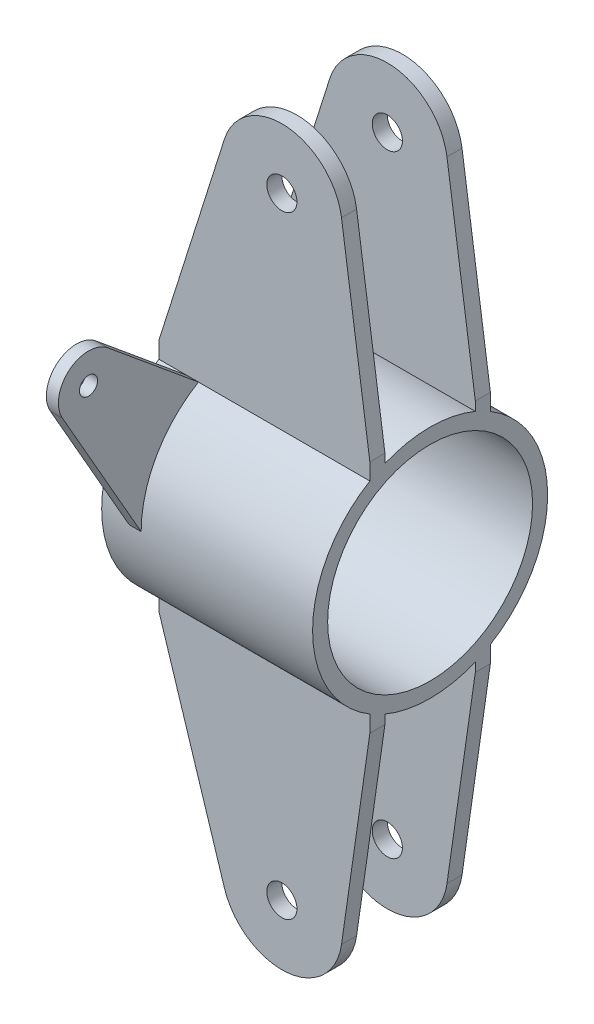
ISO-10303-21;
HEADER;
FILE_DESCRIPTION(('STEP AP214'),'2;1');
FILE_NAME('part.step','',(''),(''),'','','');
FILE_SCHEMA(('AUTOMOTIVE_DESIGN { 1 0 10303 214 1 1 1 1 }'));
ENDSEC;
DATA;
#1=APPLICATION_CONTEXT('core data for automotive mechanical design processes');
#2=APPLICATION_PROTOCOL_DEFINITION('international standard','automotive_design',2000,#1);
#3=PRODUCT_CONTEXT('',#1,'mechanical');
#4=PRODUCT('Part','Part','',(#3));
#5=PRODUCT_RELATED_PRODUCT_CATEGORY('part','',(#4));
#6=PRODUCT_DEFINITION_FORMATION('','',#4);
#7=PRODUCT_DEFINITION_CONTEXT('part definition',#1,'design');
#8=PRODUCT_DEFINITION('design','',#6,#7);
#9=PRODUCT_DEFINITION_SHAPE('','',#8);
#10=(LENGTH_UNIT() NAMED_UNIT(*) SI_UNIT(.MILLI.,.METRE.));
#11=(NAMED_UNIT(*) PLANE_ANGLE_UNIT() SI_UNIT($,.RADIAN.));
#12=(NAMED_UNIT(*) SI_UNIT($,.STERADIAN.) SOLID_ANGLE_UNIT());
#13=UNCERTAINTY_MEASURE_WITH_UNIT(LENGTH_MEASURE(1.E-05),#10,'distance_accuracy_value','');
#14=(GEOMETRIC_REPRESENTATION_CONTEXT(3) GLOBAL_UNCERTAINTY_ASSIGNED_CONTEXT((#13)) GLOBAL_UNIT_ASSIGNED_CONTEXT((#10,
#11,#12)) REPRESENTATION_CONTEXT('',''));
#15=CARTESIAN_POINT('',(0.,0.,0.));
#16=DIRECTION('',(0.,0.,1.));
#17=DIRECTION('',(1.,0.,0.));
#18=AXIS2_PLACEMENT_3D('',#15,#16,#17);
#19=CARTESIAN_POINT('',(35.,0.,0.));
#20=DIRECTION('',(-1.,0.,0.));
#21=DIRECTION('',(0.,0.,1.));
#22=AXIS2_PLACEMENT_3D('',#19,#20,#21);
#23=CYLINDRICAL_SURFACE('',#22,39.007);
#24=CARTESIAN_POINT('',(-21.9,0.,0.));
#25=DIRECTION('',(1.,0.,0.));
#26=DIRECTION('',(0.,0.,1.));
#27=AXIS2_PLACEMENT_3D('',#24,#25,#26);
#28=CIRCLE('',#27,39.007);
#29=CARTESIAN_POINT('',(-21.9,33.4894916205069,20.));
#30=VERTEX_POINT('',#29);
#31=CARTESIAN_POINT('',(-21.9,0.,39.007));
#32=VERTEX_POINT('',#31);
#33=EDGE_CURVE('E243',#30,#32,#28,.T.);
#34=ORIENTED_EDGE('',*,*,#33,.T.);
#35=DIRECTION('',(-1.,0.,0.));
#36=VECTOR('',#35,1.);
#37=CARTESIAN_POINT('',(-21.9,0.,39.007));
#38=LINE('',#37,#36);
#39=CARTESIAN_POINT('',(-25.9,0.,39.007));
#40=VERTEX_POINT('',#39);
#41=EDGE_CURVE('E227',#32,#40,#38,.T.);
#42=ORIENTED_EDGE('',*,*,#41,.T.);
#43=CARTESIAN_POINT('',(-25.9,0.,0.));
#44=DIRECTION('',(1.,0.,0.));
#45=DIRECTION('',(0.,0.,1.));
#46=AXIS2_PLACEMENT_3D('',#43,#44,#45);
#47=CIRCLE('',#46,39.007);
#48=CARTESIAN_POINT('',(-25.9,33.4894916205069,20.));
#49=VERTEX_POINT('',#48);
#50=EDGE_CURVE('E267',#49,#40,#47,.T.);
#51=ORIENTED_EDGE('',*,*,#50,.F.);
#52=DIRECTION('',(1.,0.,0.));
#53=VECTOR('',#52,1.);
#54=CARTESIAN_POINT('',(-42.4459988394961,33.4894916205069,20.));
#55=LINE('',#54,#53);
#56=CARTESIAN_POINT('',(-35.,33.4894916205069,20.));
#57=VERTEX_POINT('',#56);
#58=EDGE_CURVE('E412',#57,#49,#55,.T.);
#59=ORIENTED_EDGE('',*,*,#58,.F.);
#60=CARTESIAN_POINT('',(-35.,0.,0.));
#61=DIRECTION('',(1.,0.,0.));
#62=DIRECTION('',(0.,0.,-1.));
#63=AXIS2_PLACEMENT_3D('',#60,#61,#62);
#64=CIRCLE('',#63,39.007);
#65=CARTESIAN_POINT('',(-35.,-33.4894916205069,20.));
#66=VERTEX_POINT('',#65);
#67=EDGE_CURVE('E625',#57,#66,#64,.T.);
#68=ORIENTED_EDGE('',*,*,#67,.T.);
#69=DIRECTION('',(1.,0.,0.));
#70=VECTOR('',#69,1.);
#71=CARTESIAN_POINT('',(-42.4459988394961,-33.4894916205069,20.));
#72=LINE('',#71,#70);
#73=CARTESIAN_POINT('',(35.,-33.4894916205069,20.));
#74=VERTEX_POINT('',#73);
#75=EDGE_CURVE('E457',#66,#74,#72,.T.);
#76=ORIENTED_EDGE('',*,*,#75,.T.);
#77=CARTESIAN_POINT('',(35.,0.,0.));
#78=DIRECTION('',(1.,0.,0.));
#79=DIRECTION('',(0.,0.,-1.));
#80=AXIS2_PLACEMENT_3D('',#77,#78,#79);
#81=CIRCLE('',#80,39.007);
#82=CARTESIAN_POINT('',(35.,33.4894916205069,20.));
#83=VERTEX_POINT('',#82);
#84=EDGE_CURVE('E640',#83,#74,#81,.T.);
#85=ORIENTED_EDGE('',*,*,#84,.F.);
#86=EDGE_CURVE('E250',#30,#83,#55,.T.);
#87=ORIENTED_EDGE('',*,*,#86,.F.);
#88=EDGE_LOOP('',(#34,#42,#51,#59,#68,#76,#85,#87));
#89=FACE_BOUND('',#88,.T.);
#90=ADVANCED_FACE('F39',(#89),#23,.T.);
#91=CARTESIAN_POINT('',(-35.,-33.4894916205069,-20.));
#92=VERTEX_POINT('',#91);
#93=CARTESIAN_POINT('',(-35.,33.4894916205069,-20.));
#94=VERTEX_POINT('',#93);
#95=EDGE_CURVE('E43',#92,#94,#64,.T.);
#96=ORIENTED_EDGE('',*,*,#95,.T.);
#97=DIRECTION('',(1.,0.,0.));
#98=VECTOR('',#97,1.);
#99=CARTESIAN_POINT('',(-42.4459988394961,33.4894916205069,-20.));
#100=LINE('',#99,#98);
#101=CARTESIAN_POINT('',(35.,33.4894916205069,-20.));
#102=VERTEX_POINT('',#101);
#103=EDGE_CURVE('E327',#94,#102,#100,.T.);
#104=ORIENTED_EDGE('',*,*,#103,.T.);
#105=CARTESIAN_POINT('',(35.,-33.4894916205069,-20.));
#106=VERTEX_POINT('',#105);
#107=EDGE_CURVE('E11',#106,#102,#81,.T.);
#108=ORIENTED_EDGE('',*,*,#107,.F.);
#109=DIRECTION('',(1.,0.,0.));
#110=VECTOR('',#109,1.);
#111=CARTESIAN_POINT('',(-42.4459988394961,-33.4894916205069,-20.));
#112=LINE('',#111,#110);
#113=EDGE_CURVE('E545',#92,#106,#112,.T.);
#114=ORIENTED_EDGE('',*,*,#113,.F.);
#115=EDGE_LOOP('',(#96,#104,#108,#114));
#116=FACE_BOUND('',#115,.T.);
#117=ADVANCED_FACE('F579',(#116),#23,.T.);
#118=CARTESIAN_POINT('',(35.,36.0075832152062,-15.));
#119=VERTEX_POINT('',#118);
#120=CARTESIAN_POINT('',(35.,36.0075832152062,15.));
#121=VERTEX_POINT('',#120);
#122=EDGE_CURVE('E49',#119,#121,#81,.T.);
#123=ORIENTED_EDGE('',*,*,#122,.F.);
#124=DIRECTION('',(1.,0.,0.));
#125=VECTOR('',#124,1.);
#126=CARTESIAN_POINT('',(-42.4459988394961,36.0075832152062,-15.));
#127=LINE('',#126,#125);
#128=CARTESIAN_POINT('',(-35.,36.0075832152062,-15.));
#129=VERTEX_POINT('',#128);
#130=EDGE_CURVE('E341',#129,#119,#127,.T.);
#131=ORIENTED_EDGE('',*,*,#130,.F.);
#132=CARTESIAN_POINT('',(-35.,36.0075832152062,15.));
#133=VERTEX_POINT('',#132);
#134=EDGE_CURVE('E595',#129,#133,#64,.T.);
#135=ORIENTED_EDGE('',*,*,#134,.T.);
#136=DIRECTION('',(1.,0.,0.));
#137=VECTOR('',#136,1.);
#138=CARTESIAN_POINT('',(-42.4459988394961,36.0075832152062,15.));
#139=LINE('',#138,#137);
#140=EDGE_CURVE('E390',#133,#121,#139,.T.);
#141=ORIENTED_EDGE('',*,*,#140,.T.);
#142=EDGE_LOOP('',(#123,#131,#135,#141));
#143=FACE_BOUND('',#142,.T.);
#144=ADVANCED_FACE('F576',(#143),#23,.T.);
#145=CARTESIAN_POINT('',(35.,0.,0.));
#146=DIRECTION('',(1.,0.,0.));
#147=DIRECTION('',(0.,0.,-1.));
#148=AXIS2_PLACEMENT_3D('',#145,#146,#147);
#149=PLANE('',#148);
#150=ORIENTED_EDGE('',*,*,#107,.T.);
#151=DIRECTION('',(0.,1.,0.));
#152=VECTOR('',#151,1.);
#153=CARTESIAN_POINT('',(35.,39.007,-20.));
#154=LINE('',#153,#152);
#155=CARTESIAN_POINT('',(35.,39.007,-20.));
#156=VERTEX_POINT('',#155);
#157=EDGE_CURVE('E320',#102,#156,#154,.T.);
#158=ORIENTED_EDGE('',*,*,#157,.T.);
#159=DIRECTION('',(0.,0.,1.));
#160=VECTOR('',#159,1.);
#161=CARTESIAN_POINT('',(35.,39.007,-20.));
#162=LINE('',#161,#160);
#163=CARTESIAN_POINT('',(35.,39.007,-15.));
#164=VERTEX_POINT('',#163);
#165=EDGE_CURVE('E334',#156,#164,#162,.T.);
#166=ORIENTED_EDGE('',*,*,#165,.T.);
#167=DIRECTION('',(0.,-1.,0.));
#168=VECTOR('',#167,1.);
#169=CARTESIAN_POINT('',(35.,39.007,-15.));
#170=LINE('',#169,#168);
#171=EDGE_CURVE('E337',#164,#119,#170,.T.);
#172=ORIENTED_EDGE('',*,*,#171,.T.);
#173=ORIENTED_EDGE('',*,*,#122,.T.);
#174=DIRECTION('',(0.,1.,0.));
#175=VECTOR('',#174,1.);
#176=CARTESIAN_POINT('',(35.,39.007,15.));
#177=LINE('',#176,#175);
#178=CARTESIAN_POINT('',(35.,39.007,15.));
#179=VERTEX_POINT('',#178);
#180=EDGE_CURVE('E402',#121,#179,#177,.T.);
#181=ORIENTED_EDGE('',*,*,#180,.T.);
#182=DIRECTION('',(0.,0.,1.));
#183=VECTOR('',#182,1.);
#184=CARTESIAN_POINT('',(35.,39.007,20.));
#185=LINE('',#184,#183);
#186=CARTESIAN_POINT('',(35.,39.007,20.));
#187=VERTEX_POINT('',#186);
#188=EDGE_CURVE('E406',#179,#187,#185,.T.);
#189=ORIENTED_EDGE('',*,*,#188,.T.);
#190=DIRECTION('',(0.,-1.,0.));
#191=VECTOR('',#190,1.);
#192=CARTESIAN_POINT('',(35.,39.007,20.));
#193=LINE('',#192,#191);
#194=EDGE_CURVE('E384',#187,#83,#193,.T.);
#195=ORIENTED_EDGE('',*,*,#194,.T.);
#196=ORIENTED_EDGE('',*,*,#84,.T.);
#197=DIRECTION('',(0.,-1.,0.));
#198=VECTOR('',#197,1.);
#199=CARTESIAN_POINT('',(35.,-39.007,20.));
#200=LINE('',#199,#198);
#201=CARTESIAN_POINT('',(35.,-39.007,20.));
#202=VERTEX_POINT('',#201);
#203=EDGE_CURVE('E451',#74,#202,#200,.T.);
#204=ORIENTED_EDGE('',*,*,#203,.T.);
#205=DIRECTION('',(0.,0.,-1.));
#206=VECTOR('',#205,1.);
#207=CARTESIAN_POINT('',(35.,-39.007,20.));
#208=LINE('',#207,#206);
#209=CARTESIAN_POINT('',(35.,-39.007,15.));
#210=VERTEX_POINT('',#209);
#211=EDGE_CURVE('E465',#202,#210,#208,.T.);
#212=ORIENTED_EDGE('',*,*,#211,.T.);
#213=DIRECTION('',(0.,1.,0.));
#214=VECTOR('',#213,1.);
#215=CARTESIAN_POINT('',(35.,-39.007,15.));
#216=LINE('',#215,#214);
#217=CARTESIAN_POINT('',(35.,-36.0075832152062,15.));
#218=VERTEX_POINT('',#217);
#219=EDGE_CURVE('E469',#210,#218,#216,.T.);
#220=ORIENTED_EDGE('',*,*,#219,.T.);
#221=CARTESIAN_POINT('',(35.,-36.0075832152062,-15.));
#222=VERTEX_POINT('',#221);
#223=EDGE_CURVE('E50',#218,#222,#81,.T.);
#224=ORIENTED_EDGE('',*,*,#223,.T.);
#225=DIRECTION('',(0.,-1.,0.));
#226=VECTOR('',#225,1.);
#227=CARTESIAN_POINT('',(35.,-39.007,-15.));
#228=LINE('',#227,#226);
#229=CARTESIAN_POINT('',(35.,-39.007,-15.));
#230=VERTEX_POINT('',#229);
#231=EDGE_CURVE('E537',#222,#230,#228,.T.);
#232=ORIENTED_EDGE('',*,*,#231,.T.);
#233=DIRECTION('',(0.,0.,-1.));
#234=VECTOR('',#233,1.);
#235=CARTESIAN_POINT('',(35.,-39.007,-20.));
#236=LINE('',#235,#234);
#237=CARTESIAN_POINT('',(35.,-39.007,-20.));
#238=VERTEX_POINT('',#237);
#239=EDGE_CURVE('E541',#230,#238,#236,.T.);
#240=ORIENTED_EDGE('',*,*,#239,.T.);
#241=DIRECTION('',(0.,1.,0.));
#242=VECTOR('',#241,1.);
#243=CARTESIAN_POINT('',(35.,-39.007,-20.));
#244=LINE('',#243,#242);
#245=EDGE_CURVE('E517',#238,#106,#244,.T.);
#246=ORIENTED_EDGE('',*,*,#245,.T.);
#247=EDGE_LOOP('',(#150,#158,#166,#172,#173,#181,#189,#195,#196,#204,#212,#220,#224,#232,#240,#246));
#248=FACE_BOUND('',#247,.T.);
#249=CARTESIAN_POINT('',(35.,0.,0.));
#250=DIRECTION('',(1.,0.,0.));
#251=DIRECTION('',(0.,0.,-1.));
#252=AXIS2_PLACEMENT_3D('',#249,#250,#251);
#253=CIRCLE('',#252,34.007);
#254=CARTESIAN_POINT('',(35.,0.,-34.007));
#255=VERTEX_POINT('',#254);
#256=EDGE_CURVE('E552',#255,#255,#253,.T.);
#257=ORIENTED_EDGE('',*,*,#256,.F.);
#258=EDGE_LOOP('',(#257));
#259=FACE_BOUND('',#258,.T.);
#260=ADVANCED_FACE('F589',(#248,#259),#149,.T.);
#261=CARTESIAN_POINT('',(-35.,0.,0.));
#262=DIRECTION('',(1.,0.,0.));
#263=DIRECTION('',(0.,0.,-1.));
#264=AXIS2_PLACEMENT_3D('',#261,#262,#263);
#265=PLANE('',#264);
#266=ORIENTED_EDGE('',*,*,#95,.F.);
#267=DIRECTION('',(0.,-1.,0.));
#268=VECTOR('',#267,1.);
#269=CARTESIAN_POINT('',(-35.,-39.007,-20.));
#270=LINE('',#269,#268);
#271=CARTESIAN_POINT('',(-35.,-39.007,-20.));
#272=VERTEX_POINT('',#271);
#273=EDGE_CURVE('E529',#92,#272,#270,.T.);
#274=ORIENTED_EDGE('',*,*,#273,.T.);
#275=DIRECTION('',(0.,0.,1.));
#276=VECTOR('',#275,1.);
#277=CARTESIAN_POINT('',(-35.,-39.007,-20.));
#278=LINE('',#277,#276);
#279=CARTESIAN_POINT('',(-35.,-39.007,-15.));
#280=VERTEX_POINT('',#279);
#281=EDGE_CURVE('E524',#272,#280,#278,.T.);
#282=ORIENTED_EDGE('',*,*,#281,.T.);
#283=DIRECTION('',(0.,1.,0.));
#284=VECTOR('',#283,1.);
#285=CARTESIAN_POINT('',(-35.,-39.007,-15.));
#286=LINE('',#285,#284);
#287=CARTESIAN_POINT('',(-35.,-36.0075832152062,-15.));
#288=VERTEX_POINT('',#287);
#289=EDGE_CURVE('E520',#280,#288,#286,.T.);
#290=ORIENTED_EDGE('',*,*,#289,.T.);
#291=CARTESIAN_POINT('',(-35.,-36.0075832152062,15.));
#292=VERTEX_POINT('',#291);
#293=EDGE_CURVE('E556',#292,#288,#64,.T.);
#294=ORIENTED_EDGE('',*,*,#293,.F.);
#295=DIRECTION('',(0.,-1.,0.));
#296=VECTOR('',#295,1.);
#297=CARTESIAN_POINT('',(-35.,-39.007,15.));
#298=LINE('',#297,#296);
#299=CARTESIAN_POINT('',(-35.,-39.007,15.));
#300=VERTEX_POINT('',#299);
#301=EDGE_CURVE('E452',#292,#300,#298,.T.);
#302=ORIENTED_EDGE('',*,*,#301,.T.);
#303=DIRECTION('',(0.,0.,1.));
#304=VECTOR('',#303,1.);
#305=CARTESIAN_POINT('',(-35.,-39.007,20.));
#306=LINE('',#305,#304);
#307=CARTESIAN_POINT('',(-35.,-39.007,20.));
#308=VERTEX_POINT('',#307);
#309=EDGE_CURVE('E461',#300,#308,#306,.T.);
#310=ORIENTED_EDGE('',*,*,#309,.T.);
#311=DIRECTION('',(0.,1.,0.));
#312=VECTOR('',#311,1.);
#313=CARTESIAN_POINT('',(-35.,-39.007,20.));
#314=LINE('',#313,#312);
#315=EDGE_CURVE('E456',#308,#66,#314,.T.);
#316=ORIENTED_EDGE('',*,*,#315,.T.);
#317=ORIENTED_EDGE('',*,*,#67,.F.);
#318=DIRECTION('',(0.,1.,0.));
#319=VECTOR('',#318,1.);
#320=CARTESIAN_POINT('',(-35.,39.007,20.));
#321=LINE('',#320,#319);
#322=CARTESIAN_POINT('',(-35.,39.007,20.));
#323=VERTEX_POINT('',#322);
#324=EDGE_CURVE('E394',#57,#323,#321,.T.);
#325=ORIENTED_EDGE('',*,*,#324,.T.);
#326=DIRECTION('',(0.,0.,-1.));
#327=VECTOR('',#326,1.);
#328=CARTESIAN_POINT('',(-35.,39.007,20.));
#329=LINE('',#328,#327);
#330=CARTESIAN_POINT('',(-35.,39.007,15.));
#331=VERTEX_POINT('',#330);
#332=EDGE_CURVE('E389',#323,#331,#329,.T.);
#333=ORIENTED_EDGE('',*,*,#332,.T.);
#334=DIRECTION('',(0.,-1.,0.));
#335=VECTOR('',#334,1.);
#336=CARTESIAN_POINT('',(-35.,39.007,15.));
#337=LINE('',#336,#335);
#338=EDGE_CURVE('E385',#331,#133,#337,.T.);
#339=ORIENTED_EDGE('',*,*,#338,.T.);
#340=ORIENTED_EDGE('',*,*,#134,.F.);
#341=DIRECTION('',(0.,1.,0.));
#342=VECTOR('',#341,1.);
#343=CARTESIAN_POINT('',(-35.,39.007,-15.));
#344=LINE('',#343,#342);
#345=CARTESIAN_POINT('',(-35.,39.007,-15.));
#346=VERTEX_POINT('',#345);
#347=EDGE_CURVE('E323',#129,#346,#344,.T.);
#348=ORIENTED_EDGE('',*,*,#347,.T.);
#349=DIRECTION('',(0.,0.,-1.));
#350=VECTOR('',#349,1.);
#351=CARTESIAN_POINT('',(-35.,39.007,-20.));
#352=LINE('',#351,#350);
#353=CARTESIAN_POINT('',(-35.,39.007,-20.));
#354=VERTEX_POINT('',#353);
#355=EDGE_CURVE('E331',#346,#354,#352,.T.);
#356=ORIENTED_EDGE('',*,*,#355,.T.);
#357=DIRECTION('',(0.,-1.,0.));
#358=VECTOR('',#357,1.);
#359=CARTESIAN_POINT('',(-35.,39.007,-20.));
#360=LINE('',#359,#358);
#361=EDGE_CURVE('E326',#354,#94,#360,.T.);
#362=ORIENTED_EDGE('',*,*,#361,.T.);
#363=EDGE_LOOP('',(#266,#274,#282,#290,#294,#302,#310,#316,#317,#325,#333,#339,#340,#348,#356,#362));
#364=FACE_BOUND('',#363,.T.);
#365=CARTESIAN_POINT('',(-35.,0.,0.));
#366=DIRECTION('',(1.,0.,0.));
#367=DIRECTION('',(0.,0.,-1.));
#368=AXIS2_PLACEMENT_3D('',#365,#366,#367);
#369=CIRCLE('',#368,34.007);
#370=CARTESIAN_POINT('',(-35.,0.,-34.007));
#371=VERTEX_POINT('',#370);
#372=EDGE_CURVE('E533',#371,#371,#369,.T.);
#373=ORIENTED_EDGE('',*,*,#372,.T.);
#374=EDGE_LOOP('',(#373));
#375=FACE_BOUND('',#374,.T.);
#376=ADVANCED_FACE('F561',(#364,#375),#265,.F.);
#377=ORIENTED_EDGE('',*,*,#223,.F.);
#378=DIRECTION('',(1.,0.,0.));
#379=VECTOR('',#378,1.);
#380=CARTESIAN_POINT('',(-42.4459988394961,-36.0075832152062,15.));
#381=LINE('',#380,#379);
#382=EDGE_CURVE('E473',#292,#218,#381,.T.);
#383=ORIENTED_EDGE('',*,*,#382,.F.);
#384=ORIENTED_EDGE('',*,*,#293,.T.);
#385=DIRECTION('',(1.,0.,0.));
#386=VECTOR('',#385,1.);
#387=CARTESIAN_POINT('',(-42.4459988394961,-36.0075832152062,-15.));
#388=LINE('',#387,#386);
#389=EDGE_CURVE('E525',#288,#222,#388,.T.);
#390=ORIENTED_EDGE('',*,*,#389,.T.);
#391=EDGE_LOOP('',(#377,#383,#384,#390));
#392=FACE_BOUND('',#391,.T.);
#393=ADVANCED_FACE('F41',(#392),#23,.T.);
#394=CARTESIAN_POINT('',(35.,0.,0.));
#395=DIRECTION('',(-1.,0.,0.));
#396=DIRECTION('',(0.,0.,1.));
#397=AXIS2_PLACEMENT_3D('',#394,#395,#396);
#398=CYLINDRICAL_SURFACE('',#397,34.007);
#399=ORIENTED_EDGE('',*,*,#256,.T.);
#400=EDGE_LOOP('',(#399));
#401=FACE_BOUND('',#400,.T.);
#402=ORIENTED_EDGE('',*,*,#372,.F.);
#403=EDGE_LOOP('',(#402));
#404=FACE_BOUND('',#403,.T.);
#405=ADVANCED_FACE('F563',(#401,#404),#398,.F.);
#406=CARTESIAN_POINT('',(-42.4459988394961,-39.007,-20.));
#407=DIRECTION('',(0.,0.,-1.));
#408=DIRECTION('',(-1.,0.,0.));
#409=AXIS2_PLACEMENT_3D('',#406,#407,#408);
#410=PLANE('',#409);
#411=ORIENTED_EDGE('',*,*,#273,.F.);
#412=ORIENTED_EDGE('',*,*,#113,.T.);
#413=ORIENTED_EDGE('',*,*,#245,.F.);
#414=DIRECTION('',(0.142238081932219,0.989832474739157,0.));
#415=VECTOR('',#414,1.);
#416=CARTESIAN_POINT('',(25.5966494947831,-104.444761638644,-20.));
#417=LINE('',#416,#415);
#418=CARTESIAN_POINT('',(25.5966494947831,-104.444761638644,-20.));
#419=VERTEX_POINT('',#418);
#420=EDGE_CURVE('E501',#419,#238,#417,.T.);
#421=ORIENTED_EDGE('',*,*,#420,.F.);
#422=CARTESIAN_POINT('',(5.8,-101.6,-20.));
#423=DIRECTION('',(0.,0.,1.));
#424=DIRECTION('',(1.,0.,0.));
#425=AXIS2_PLACEMENT_3D('',#422,#423,#424);
#426=CIRCLE('',#425,20.);
#427=CARTESIAN_POINT('',(-13.2668398670798,-107.637848746295,-20.));
#428=VERTEX_POINT('',#427);
#429=EDGE_CURVE('E496',#428,#419,#426,.T.);
#430=ORIENTED_EDGE('',*,*,#429,.F.);
#431=DIRECTION('',(0.301892437314758,-0.953341993353988,0.));
#432=VECTOR('',#431,1.);
#433=CARTESIAN_POINT('',(-35.,-39.007,-20.));
#434=LINE('',#433,#432);
#435=EDGE_CURVE('E492',#272,#428,#434,.T.);
#436=ORIENTED_EDGE('',*,*,#435,.F.);
#437=EDGE_LOOP('',(#411,#412,#413,#421,#430,#436));
#438=FACE_BOUND('',#437,.T.);
#439=CARTESIAN_POINT('',(5.8,-101.6,-20.));
#440=DIRECTION('',(0.,0.,1.));
#441=DIRECTION('',(1.,0.,0.));
#442=AXIS2_PLACEMENT_3D('',#439,#440,#441);
#443=CIRCLE('',#442,5.007);
#444=CARTESIAN_POINT('',(10.807,-101.6,-20.));
#445=VERTEX_POINT('',#444);
#446=EDGE_CURVE('E484',#445,#445,#443,.T.);
#447=ORIENTED_EDGE('',*,*,#446,.T.);
#448=EDGE_LOOP('',(#447));
#449=FACE_BOUND('',#448,.T.);
#450=ADVANCED_FACE('F565',(#438,#449),#410,.T.);
#451=CARTESIAN_POINT('',(-42.4459988394961,-39.007,-15.));
#452=DIRECTION('',(0.,0.,1.));
#453=DIRECTION('',(1.,0.,0.));
#454=AXIS2_PLACEMENT_3D('',#451,#452,#453);
#455=PLANE('',#454);
#456=ORIENTED_EDGE('',*,*,#289,.F.);
#457=DIRECTION('',(0.301892437314758,-0.953341993353988,0.));
#458=VECTOR('',#457,1.);
#459=CARTESIAN_POINT('',(-35.,-39.007,-15.));
#460=LINE('',#459,#458);
#461=CARTESIAN_POINT('',(-13.2668398670798,-107.637848746295,-15.));
#462=VERTEX_POINT('',#461);
#463=EDGE_CURVE('E488',#280,#462,#460,.T.);
#464=ORIENTED_EDGE('',*,*,#463,.T.);
#465=CARTESIAN_POINT('',(5.8,-101.6,-15.));
#466=DIRECTION('',(0.,0.,1.));
#467=DIRECTION('',(1.,0.,0.));
#468=AXIS2_PLACEMENT_3D('',#465,#466,#467);
#469=CIRCLE('',#468,20.);
#470=CARTESIAN_POINT('',(25.5966494947831,-104.444761638644,-15.));
#471=VERTEX_POINT('',#470);
#472=EDGE_CURVE('E508',#462,#471,#469,.T.);
#473=ORIENTED_EDGE('',*,*,#472,.T.);
#474=DIRECTION('',(0.142238081932219,0.989832474739157,0.));
#475=VECTOR('',#474,1.);
#476=CARTESIAN_POINT('',(25.5966494947831,-104.444761638644,-15.));
#477=LINE('',#476,#475);
#478=EDGE_CURVE('E497',#471,#230,#477,.T.);
#479=ORIENTED_EDGE('',*,*,#478,.T.);
#480=ORIENTED_EDGE('',*,*,#231,.F.);
#481=ORIENTED_EDGE('',*,*,#389,.F.);
#482=EDGE_LOOP('',(#456,#464,#473,#479,#480,#481));
#483=FACE_BOUND('',#482,.T.);
#484=CARTESIAN_POINT('',(5.8,-101.6,-15.));
#485=DIRECTION('',(0.,0.,1.));
#486=DIRECTION('',(1.,0.,0.));
#487=AXIS2_PLACEMENT_3D('',#484,#485,#486);
#488=CIRCLE('',#487,5.007);
#489=CARTESIAN_POINT('',(10.807,-101.6,-15.));
#490=VERTEX_POINT('',#489);
#491=EDGE_CURVE('E483',#490,#490,#488,.T.);
#492=ORIENTED_EDGE('',*,*,#491,.F.);
#493=EDGE_LOOP('',(#492));
#494=FACE_BOUND('',#493,.T.);
#495=ADVANCED_FACE('F572',(#483,#494),#455,.T.);
#496=CARTESIAN_POINT('',(25.5966494947831,-104.444761638644,-20.));
#497=DIRECTION('',(0.989832474739157,-0.142238081932219,0.));
#498=DIRECTION('',(0.142238081932219,0.989832474739157,0.));
#499=AXIS2_PLACEMENT_3D('',#496,#497,#498);
#500=PLANE('',#499);
#501=ORIENTED_EDGE('',*,*,#478,.F.);
#502=DIRECTION('',(0.,0.,1.));
#503=VECTOR('',#502,1.);
#504=CARTESIAN_POINT('',(25.5966494947831,-104.444761638644,-20.));
#505=LINE('',#504,#503);
#506=EDGE_CURVE('E514',#419,#471,#505,.T.);
#507=ORIENTED_EDGE('',*,*,#506,.F.);
#508=ORIENTED_EDGE('',*,*,#420,.T.);
#509=ORIENTED_EDGE('',*,*,#239,.F.);
#510=EDGE_LOOP('',(#501,#507,#508,#509));
#511=FACE_BOUND('',#510,.T.);
#512=ADVANCED_FACE('F699',(#511),#500,.T.);
#513=CARTESIAN_POINT('',(5.8,-101.6,-20.));
#514=DIRECTION('',(0.,0.,1.));
#515=DIRECTION('',(1.,0.,0.));
#516=AXIS2_PLACEMENT_3D('',#513,#514,#515);
#517=CYLINDRICAL_SURFACE('',#516,20.);
#518=ORIENTED_EDGE('',*,*,#472,.F.);
#519=DIRECTION('',(0.,0.,1.));
#520=VECTOR('',#519,1.);
#521=CARTESIAN_POINT('',(-13.2668398670798,-107.637848746295,-20.));
#522=LINE('',#521,#520);
#523=EDGE_CURVE('E504',#428,#462,#522,.T.);
#524=ORIENTED_EDGE('',*,*,#523,.F.);
#525=ORIENTED_EDGE('',*,*,#429,.T.);
#526=ORIENTED_EDGE('',*,*,#506,.T.);
#527=EDGE_LOOP('',(#518,#524,#525,#526));
#528=FACE_BOUND('',#527,.T.);
#529=ADVANCED_FACE('F702',(#528),#517,.T.);
#530=CARTESIAN_POINT('',(-35.,-39.007,-20.));
#531=DIRECTION('',(-0.953341993353988,-0.301892437314758,0.));
#532=DIRECTION('',(0.301892437314758,-0.953341993353988,0.));
#533=AXIS2_PLACEMENT_3D('',#530,#531,#532);
#534=PLANE('',#533);
#535=ORIENTED_EDGE('',*,*,#463,.F.);
#536=ORIENTED_EDGE('',*,*,#281,.F.);
#537=ORIENTED_EDGE('',*,*,#435,.T.);
#538=ORIENTED_EDGE('',*,*,#523,.T.);
#539=EDGE_LOOP('',(#535,#536,#537,#538));
#540=FACE_BOUND('',#539,.T.);
#541=ADVANCED_FACE('F697',(#540),#534,.T.);
#542=CARTESIAN_POINT('',(5.8,-101.6,-20.));
#543=DIRECTION('',(0.,0.,1.));
#544=DIRECTION('',(1.,0.,0.));
#545=AXIS2_PLACEMENT_3D('',#542,#543,#544);
#546=CYLINDRICAL_SURFACE('',#545,5.007);
#547=ORIENTED_EDGE('',*,*,#446,.F.);
#548=EDGE_LOOP('',(#547));
#549=FACE_BOUND('',#548,.T.);
#550=ORIENTED_EDGE('',*,*,#491,.T.);
#551=EDGE_LOOP('',(#550));
#552=FACE_BOUND('',#551,.T.);
#553=ADVANCED_FACE('F694',(#549,#552),#546,.F.);
#554=CARTESIAN_POINT('',(-42.4459988394961,-39.007,20.));
#555=DIRECTION('',(0.,0.,1.));
#556=DIRECTION('',(1.,0.,0.));
#557=AXIS2_PLACEMENT_3D('',#554,#555,#556);
#558=PLANE('',#557);
#559=ORIENTED_EDGE('',*,*,#315,.F.);
#560=DIRECTION('',(0.301892437314758,-0.953341993353988,0.));
#561=VECTOR('',#560,1.);
#562=CARTESIAN_POINT('',(-35.,-39.007,20.));
#563=LINE('',#562,#561);
#564=CARTESIAN_POINT('',(-13.2668398670798,-107.637848746295,20.));
#565=VERTEX_POINT('',#564);
#566=EDGE_CURVE('E424',#308,#565,#563,.T.);
#567=ORIENTED_EDGE('',*,*,#566,.T.);
#568=CARTESIAN_POINT('',(5.8,-101.6,20.));
#569=DIRECTION('',(0.,0.,1.));
#570=DIRECTION('',(1.,0.,0.));
#571=AXIS2_PLACEMENT_3D('',#568,#569,#570);
#572=CIRCLE('',#571,20.);
#573=CARTESIAN_POINT('',(25.5966494947831,-104.444761638644,20.));
#574=VERTEX_POINT('',#573);
#575=EDGE_CURVE('E428',#565,#574,#572,.T.);
#576=ORIENTED_EDGE('',*,*,#575,.T.);
#577=DIRECTION('',(0.142238081932219,0.989832474739157,0.));
#578=VECTOR('',#577,1.);
#579=CARTESIAN_POINT('',(35.,-39.007,20.));
#580=LINE('',#579,#578);
#581=EDGE_CURVE('E432',#574,#202,#580,.T.);
#582=ORIENTED_EDGE('',*,*,#581,.T.);
#583=ORIENTED_EDGE('',*,*,#203,.F.);
#584=ORIENTED_EDGE('',*,*,#75,.F.);
#585=EDGE_LOOP('',(#559,#567,#576,#582,#583,#584));
#586=FACE_BOUND('',#585,.T.);
#587=CARTESIAN_POINT('',(5.8,-101.6,20.));
#588=DIRECTION('',(0.,0.,1.));
#589=DIRECTION('',(1.,0.,0.));
#590=AXIS2_PLACEMENT_3D('',#587,#588,#589);
#591=CIRCLE('',#590,5.007);
#592=CARTESIAN_POINT('',(10.807,-101.6,20.));
#593=VERTEX_POINT('',#592);
#594=EDGE_CURVE('E416',#593,#593,#591,.T.);
#595=ORIENTED_EDGE('',*,*,#594,.F.);
#596=EDGE_LOOP('',(#595));
#597=FACE_BOUND('',#596,.T.);
#598=ADVANCED_FACE('F662',(#586,#597),#558,.T.);
#599=CARTESIAN_POINT('',(-42.4459988394961,-39.007,15.));
#600=DIRECTION('',(0.,0.,-1.));
#601=DIRECTION('',(-1.,0.,0.));
#602=AXIS2_PLACEMENT_3D('',#599,#600,#601);
#603=PLANE('',#602);
#604=ORIENTED_EDGE('',*,*,#301,.F.);
#605=ORIENTED_EDGE('',*,*,#382,.T.);
#606=ORIENTED_EDGE('',*,*,#219,.F.);
#607=DIRECTION('',(0.142238081932219,0.989832474739157,0.));
#608=VECTOR('',#607,1.);
#609=CARTESIAN_POINT('',(35.,-39.007,15.));
#610=LINE('',#609,#608);
#611=CARTESIAN_POINT('',(25.5966494947831,-104.444761638644,15.));
#612=VERTEX_POINT('',#611);
#613=EDGE_CURVE('E429',#612,#210,#610,.T.);
#614=ORIENTED_EDGE('',*,*,#613,.F.);
#615=CARTESIAN_POINT('',(5.8,-101.6,15.));
#616=DIRECTION('',(0.,0.,1.));
#617=DIRECTION('',(1.,0.,0.));
#618=AXIS2_PLACEMENT_3D('',#615,#616,#617);
#619=CIRCLE('',#618,20.);
#620=CARTESIAN_POINT('',(-13.2668398670798,-107.637848746295,15.));
#621=VERTEX_POINT('',#620);
#622=EDGE_CURVE('E439',#621,#612,#619,.T.);
#623=ORIENTED_EDGE('',*,*,#622,.F.);
#624=DIRECTION('',(0.301892437314758,-0.953341993353988,0.));
#625=VECTOR('',#624,1.);
#626=CARTESIAN_POINT('',(-35.,-39.007,15.));
#627=LINE('',#626,#625);
#628=EDGE_CURVE('E420',#300,#621,#627,.T.);
#629=ORIENTED_EDGE('',*,*,#628,.F.);
#630=EDGE_LOOP('',(#604,#605,#606,#614,#623,#629));
#631=FACE_BOUND('',#630,.T.);
#632=CARTESIAN_POINT('',(5.8,-101.6,15.));
#633=DIRECTION('',(0.,0.,1.));
#634=DIRECTION('',(1.,0.,0.));
#635=AXIS2_PLACEMENT_3D('',#632,#633,#634);
#636=CIRCLE('',#635,5.007);
#637=CARTESIAN_POINT('',(10.807,-101.6,15.));
#638=VERTEX_POINT('',#637);
#639=EDGE_CURVE('E398',#638,#638,#636,.T.);
#640=ORIENTED_EDGE('',*,*,#639,.T.);
#641=EDGE_LOOP('',(#640));
#642=FACE_BOUND('',#641,.T.);
#643=ADVANCED_FACE('F671',(#631,#642),#603,.T.);
#644=CARTESIAN_POINT('',(-35.,-39.007,20.));
#645=DIRECTION('',(0.953341993353988,0.301892437314758,0.));
#646=DIRECTION('',(-0.301892437314758,0.953341993353988,0.));
#647=AXIS2_PLACEMENT_3D('',#644,#645,#646);
#648=PLANE('',#647);
#649=ORIENTED_EDGE('',*,*,#628,.T.);
#650=DIRECTION('',(0.,0.,-1.));
#651=VECTOR('',#650,1.);
#652=CARTESIAN_POINT('',(-13.2668398670798,-107.637848746295,20.));
#653=LINE('',#652,#651);
#654=EDGE_CURVE('E447',#565,#621,#653,.T.);
#655=ORIENTED_EDGE('',*,*,#654,.F.);
#656=ORIENTED_EDGE('',*,*,#566,.F.);
#657=ORIENTED_EDGE('',*,*,#309,.F.);
#658=EDGE_LOOP('',(#649,#655,#656,#657));
#659=FACE_BOUND('',#658,.T.);
#660=ADVANCED_FACE('F676',(#659),#648,.F.);
#661=CARTESIAN_POINT('',(5.8,-101.6,20.));
#662=DIRECTION('',(0.,0.,-1.));
#663=DIRECTION('',(-1.,0.,0.));
#664=AXIS2_PLACEMENT_3D('',#661,#662,#663);
#665=CYLINDRICAL_SURFACE('',#664,20.);
#666=ORIENTED_EDGE('',*,*,#622,.T.);
#667=DIRECTION('',(0.,0.,-1.));
#668=VECTOR('',#667,1.);
#669=CARTESIAN_POINT('',(25.5966494947831,-104.444761638644,20.));
#670=LINE('',#669,#668);
#671=EDGE_CURVE('E435',#574,#612,#670,.T.);
#672=ORIENTED_EDGE('',*,*,#671,.F.);
#673=ORIENTED_EDGE('',*,*,#575,.F.);
#674=ORIENTED_EDGE('',*,*,#654,.T.);
#675=EDGE_LOOP('',(#666,#672,#673,#674));
#676=FACE_BOUND('',#675,.T.);
#677=ADVANCED_FACE('F678',(#676),#665,.T.);
#678=CARTESIAN_POINT('',(35.,-39.007,20.));
#679=DIRECTION('',(-0.989832474739157,0.142238081932219,0.));
#680=DIRECTION('',(-0.142238081932219,-0.989832474739157,0.));
#681=AXIS2_PLACEMENT_3D('',#678,#679,#680);
#682=PLANE('',#681);
#683=ORIENTED_EDGE('',*,*,#613,.T.);
#684=ORIENTED_EDGE('',*,*,#211,.F.);
#685=ORIENTED_EDGE('',*,*,#581,.F.);
#686=ORIENTED_EDGE('',*,*,#671,.T.);
#687=EDGE_LOOP('',(#683,#684,#685,#686));
#688=FACE_BOUND('',#687,.T.);
#689=ADVANCED_FACE('F667',(#688),#682,.F.);
#690=CARTESIAN_POINT('',(5.8,-101.6,20.));
#691=DIRECTION('',(0.,0.,-1.));
#692=DIRECTION('',(-1.,0.,0.));
#693=AXIS2_PLACEMENT_3D('',#690,#691,#692);
#694=CYLINDRICAL_SURFACE('',#693,5.007);
#695=ORIENTED_EDGE('',*,*,#594,.T.);
#696=EDGE_LOOP('',(#695));
#697=FACE_BOUND('',#696,.T.);
#698=ORIENTED_EDGE('',*,*,#639,.F.);
#699=EDGE_LOOP('',(#698));
#700=FACE_BOUND('',#699,.T.);
#701=ADVANCED_FACE('F685',(#697,#700),#694,.F.);
#702=CARTESIAN_POINT('',(-42.4459988394961,39.007,20.));
#703=DIRECTION('',(0.,0.,1.));
#704=DIRECTION('',(1.,0.,0.));
#705=AXIS2_PLACEMENT_3D('',#702,#703,#704);
#706=PLANE('',#705);
#707=ORIENTED_EDGE('',*,*,#324,.F.);
#708=ORIENTED_EDGE('',*,*,#58,.T.);
#709=DIRECTION('',(-1.,0.,0.));
#710=VECTOR('',#709,1.);
#711=CARTESIAN_POINT('',(-21.9,33.4894916205069,20.));
#712=LINE('',#711,#710);
#713=EDGE_CURVE('E276',#30,#49,#712,.T.);
#714=ORIENTED_EDGE('',*,*,#713,.F.);
#715=ORIENTED_EDGE('',*,*,#86,.T.);
#716=ORIENTED_EDGE('',*,*,#194,.F.);
#717=DIRECTION('',(-0.14223808193222,0.989832474739157,0.));
#718=VECTOR('',#717,1.);
#719=CARTESIAN_POINT('',(35.,39.007,20.));
#720=LINE('',#719,#718);
#721=CARTESIAN_POINT('',(25.5966494947831,104.444761638644,20.));
#722=VERTEX_POINT('',#721);
#723=EDGE_CURVE('E357',#187,#722,#720,.T.);
#724=ORIENTED_EDGE('',*,*,#723,.T.);
#725=CARTESIAN_POINT('',(5.79999999999994,101.6,20.));
#726=DIRECTION('',(0.,0.,1.));
#727=DIRECTION('',(1.,0.,0.));
#728=AXIS2_PLACEMENT_3D('',#725,#726,#727);
#729=CIRCLE('',#728,20.);
#730=CARTESIAN_POINT('',(-13.2668398670798,107.637848746295,20.));
#731=VERTEX_POINT('',#730);
#732=EDGE_CURVE('E361',#722,#731,#729,.T.);
#733=ORIENTED_EDGE('',*,*,#732,.T.);
#734=DIRECTION('',(-0.301892437314758,-0.953341993353988,0.));
#735=VECTOR('',#734,1.);
#736=CARTESIAN_POINT('',(-35.,39.007,20.));
#737=LINE('',#736,#735);
#738=EDGE_CURVE('E365',#731,#323,#737,.T.);
#739=ORIENTED_EDGE('',*,*,#738,.T.);
#740=EDGE_LOOP('',(#707,#708,#714,#715,#716,#724,#733,#739));
#741=FACE_BOUND('',#740,.T.);
#742=CARTESIAN_POINT('',(5.79999999999994,101.6,20.));
#743=DIRECTION('',(0.,0.,1.));
#744=DIRECTION('',(1.,0.,0.));
#745=AXIS2_PLACEMENT_3D('',#742,#743,#744);
#746=CIRCLE('',#745,5.007);
#747=CARTESIAN_POINT('',(10.8069999999999,101.6,20.));
#748=VERTEX_POINT('',#747);
#749=EDGE_CURVE('E349',#748,#748,#746,.T.);
#750=ORIENTED_EDGE('',*,*,#749,.F.);
#751=EDGE_LOOP('',(#750));
#752=FACE_BOUND('',#751,.T.);
#753=ADVANCED_FACE('F655',(#741,#752),#706,.T.);
#754=CARTESIAN_POINT('',(-42.4459988394961,39.007,15.));
#755=DIRECTION('',(0.,0.,-1.));
#756=DIRECTION('',(-1.,0.,0.));
#757=AXIS2_PLACEMENT_3D('',#754,#755,#756);
#758=PLANE('',#757);
#759=ORIENTED_EDGE('',*,*,#338,.F.);
#760=DIRECTION('',(-0.301892437314758,-0.953341993353988,0.));
#761=VECTOR('',#760,1.);
#762=CARTESIAN_POINT('',(-35.,39.007,15.));
#763=LINE('',#762,#761);
#764=CARTESIAN_POINT('',(-13.2668398670798,107.637848746295,15.));
#765=VERTEX_POINT('',#764);
#766=EDGE_CURVE('E362',#765,#331,#763,.T.);
#767=ORIENTED_EDGE('',*,*,#766,.F.);
#768=CARTESIAN_POINT('',(5.79999999999994,101.6,15.));
#769=DIRECTION('',(0.,0.,1.));
#770=DIRECTION('',(1.,0.,0.));
#771=AXIS2_PLACEMENT_3D('',#768,#769,#770);
#772=CIRCLE('',#771,20.);
#773=CARTESIAN_POINT('',(25.5966494947831,104.444761638644,15.));
#774=VERTEX_POINT('',#773);
#775=EDGE_CURVE('E372',#774,#765,#772,.T.);
#776=ORIENTED_EDGE('',*,*,#775,.F.);
#777=DIRECTION('',(-0.14223808193222,0.989832474739157,0.));
#778=VECTOR('',#777,1.);
#779=CARTESIAN_POINT('',(35.,39.007,15.));
#780=LINE('',#779,#778);
#781=EDGE_CURVE('E353',#179,#774,#780,.T.);
#782=ORIENTED_EDGE('',*,*,#781,.F.);
#783=ORIENTED_EDGE('',*,*,#180,.F.);
#784=ORIENTED_EDGE('',*,*,#140,.F.);
#785=EDGE_LOOP('',(#759,#767,#776,#782,#783,#784));
#786=FACE_BOUND('',#785,.T.);
#787=CARTESIAN_POINT('',(5.79999999999994,101.6,15.));
#788=DIRECTION('',(0.,0.,1.));
#789=DIRECTION('',(1.,0.,0.));
#790=AXIS2_PLACEMENT_3D('',#787,#788,#789);
#791=CIRCLE('',#790,5.007);
#792=CARTESIAN_POINT('',(10.8069999999999,101.6,15.));
#793=VERTEX_POINT('',#792);
#794=EDGE_CURVE('E348',#793,#793,#791,.T.);
#795=ORIENTED_EDGE('',*,*,#794,.T.);
#796=EDGE_LOOP('',(#795));
#797=FACE_BOUND('',#796,.T.);
#798=ADVANCED_FACE('F645',(#786,#797),#758,.T.);
#799=CARTESIAN_POINT('',(35.,39.007,20.));
#800=DIRECTION('',(-0.989832474739157,-0.14223808193222,0.));
#801=DIRECTION('',(0.14223808193222,-0.989832474739157,0.));
#802=AXIS2_PLACEMENT_3D('',#799,#800,#801);
#803=PLANE('',#802);
#804=ORIENTED_EDGE('',*,*,#781,.T.);
#805=DIRECTION('',(0.,0.,-1.));
#806=VECTOR('',#805,1.);
#807=CARTESIAN_POINT('',(25.5966494947831,104.444761638644,20.));
#808=LINE('',#807,#806);
#809=EDGE_CURVE('E380',#722,#774,#808,.T.);
#810=ORIENTED_EDGE('',*,*,#809,.F.);
#811=ORIENTED_EDGE('',*,*,#723,.F.);
#812=ORIENTED_EDGE('',*,*,#188,.F.);
#813=EDGE_LOOP('',(#804,#810,#811,#812));
#814=FACE_BOUND('',#813,.T.);
#815=ADVANCED_FACE('F651',(#814),#803,.F.);
#816=CARTESIAN_POINT('',(5.79999999999994,101.6,20.));
#817=DIRECTION('',(0.,0.,-1.));
#818=DIRECTION('',(-1.,0.,0.));
#819=AXIS2_PLACEMENT_3D('',#816,#817,#818);
#820=CYLINDRICAL_SURFACE('',#819,20.);
#821=ORIENTED_EDGE('',*,*,#775,.T.);
#822=DIRECTION('',(0.,0.,-1.));
#823=VECTOR('',#822,1.);
#824=CARTESIAN_POINT('',(-13.2668398670798,107.637848746295,20.));
#825=LINE('',#824,#823);
#826=EDGE_CURVE('E368',#731,#765,#825,.T.);
#827=ORIENTED_EDGE('',*,*,#826,.F.);
#828=ORIENTED_EDGE('',*,*,#732,.F.);
#829=ORIENTED_EDGE('',*,*,#809,.T.);
#830=EDGE_LOOP('',(#821,#827,#828,#829));
#831=FACE_BOUND('',#830,.T.);
#832=ADVANCED_FACE('F784',(#831),#820,.T.);
#833=CARTESIAN_POINT('',(-35.,39.007,20.));
#834=DIRECTION('',(0.953341993353988,-0.301892437314758,0.));
#835=DIRECTION('',(0.301892437314758,0.953341993353988,0.));
#836=AXIS2_PLACEMENT_3D('',#833,#834,#835);
#837=PLANE('',#836);
#838=ORIENTED_EDGE('',*,*,#766,.T.);
#839=ORIENTED_EDGE('',*,*,#332,.F.);
#840=ORIENTED_EDGE('',*,*,#738,.F.);
#841=ORIENTED_EDGE('',*,*,#826,.T.);
#842=EDGE_LOOP('',(#838,#839,#840,#841));
#843=FACE_BOUND('',#842,.T.);
#844=ADVANCED_FACE('F794',(#843),#837,.F.);
#845=CARTESIAN_POINT('',(5.79999999999994,101.6,20.));
#846=DIRECTION('',(0.,0.,-1.));
#847=DIRECTION('',(-1.,0.,0.));
#848=AXIS2_PLACEMENT_3D('',#845,#846,#847);
#849=CYLINDRICAL_SURFACE('',#848,5.007);
#850=ORIENTED_EDGE('',*,*,#749,.T.);
#851=EDGE_LOOP('',(#850));
#852=FACE_BOUND('',#851,.T.);
#853=ORIENTED_EDGE('',*,*,#794,.F.);
#854=EDGE_LOOP('',(#853));
#855=FACE_BOUND('',#854,.T.);
#856=ADVANCED_FACE('F804',(#852,#855),#849,.F.);
#857=CARTESIAN_POINT('',(-42.4459988394961,39.007,-20.));
#858=DIRECTION('',(0.,0.,-1.));
#859=DIRECTION('',(-1.,0.,0.));
#860=AXIS2_PLACEMENT_3D('',#857,#858,#859);
#861=PLANE('',#860);
#862=ORIENTED_EDGE('',*,*,#361,.F.);
#863=DIRECTION('',(-0.301892437314758,-0.953341993353988,0.));
#864=VECTOR('',#863,1.);
#865=CARTESIAN_POINT('',(-13.2668398670798,107.637848746295,-20.));
#866=LINE('',#865,#864);
#867=CARTESIAN_POINT('',(-13.2668398670798,107.637848746295,-20.));
#868=VERTEX_POINT('',#867);
#869=EDGE_CURVE('E293',#868,#354,#866,.T.);
#870=ORIENTED_EDGE('',*,*,#869,.F.);
#871=CARTESIAN_POINT('',(5.79999999999994,101.6,-20.));
#872=DIRECTION('',(0.,0.,1.));
#873=DIRECTION('',(1.,0.,0.));
#874=AXIS2_PLACEMENT_3D('',#871,#872,#873);
#875=CIRCLE('',#874,20.);
#876=CARTESIAN_POINT('',(25.5966494947831,104.444761638644,-20.));
#877=VERTEX_POINT('',#876);
#878=EDGE_CURVE('E302',#877,#868,#875,.T.);
#879=ORIENTED_EDGE('',*,*,#878,.F.);
#880=DIRECTION('',(-0.14223808193222,0.989832474739157,0.));
#881=VECTOR('',#880,1.);
#882=CARTESIAN_POINT('',(35.,39.007,-20.));
#883=LINE('',#882,#881);
#884=EDGE_CURVE('E297',#156,#877,#883,.T.);
#885=ORIENTED_EDGE('',*,*,#884,.F.);
#886=ORIENTED_EDGE('',*,*,#157,.F.);
#887=ORIENTED_EDGE('',*,*,#103,.F.);
#888=EDGE_LOOP('',(#862,#870,#879,#885,#886,#887));
#889=FACE_BOUND('',#888,.T.);
#890=CARTESIAN_POINT('',(5.79999999999994,101.6,-20.));
#891=DIRECTION('',(0.,0.,1.));
#892=DIRECTION('',(1.,0.,0.));
#893=AXIS2_PLACEMENT_3D('',#890,#891,#892);
#894=CIRCLE('',#893,5.007);
#895=CARTESIAN_POINT('',(10.8069999999999,101.6,-20.));
#896=VERTEX_POINT('',#895);
#897=EDGE_CURVE('E285',#896,#896,#894,.T.);
#898=ORIENTED_EDGE('',*,*,#897,.T.);
#899=EDGE_LOOP('',(#898));
#900=FACE_BOUND('',#899,.T.);
#901=ADVANCED_FACE('F601',(#889,#900),#861,.T.);
#902=CARTESIAN_POINT('',(-42.4459988394961,39.007,-15.));
#903=DIRECTION('',(0.,0.,1.));
#904=DIRECTION('',(1.,0.,0.));
#905=AXIS2_PLACEMENT_3D('',#902,#903,#904);
#906=PLANE('',#905);
#907=ORIENTED_EDGE('',*,*,#347,.F.);
#908=ORIENTED_EDGE('',*,*,#130,.T.);
#909=ORIENTED_EDGE('',*,*,#171,.F.);
#910=DIRECTION('',(-0.14223808193222,0.989832474739157,0.));
#911=VECTOR('',#910,1.);
#912=CARTESIAN_POINT('',(35.,39.007,-15.));
#913=LINE('',#912,#911);
#914=CARTESIAN_POINT('',(25.5966494947831,104.444761638644,-15.));
#915=VERTEX_POINT('',#914);
#916=EDGE_CURVE('E310',#164,#915,#913,.T.);
#917=ORIENTED_EDGE('',*,*,#916,.T.);
#918=CARTESIAN_POINT('',(5.79999999999994,101.6,-15.));
#919=DIRECTION('',(0.,0.,1.));
#920=DIRECTION('',(1.,0.,0.));
#921=AXIS2_PLACEMENT_3D('',#918,#919,#920);
#922=CIRCLE('',#921,20.);
#923=CARTESIAN_POINT('',(-13.2668398670798,107.637848746295,-15.));
#924=VERTEX_POINT('',#923);
#925=EDGE_CURVE('E298',#915,#924,#922,.T.);
#926=ORIENTED_EDGE('',*,*,#925,.T.);
#927=DIRECTION('',(-0.301892437314758,-0.953341993353988,0.));
#928=VECTOR('',#927,1.);
#929=CARTESIAN_POINT('',(-13.2668398670798,107.637848746295,-15.));
#930=LINE('',#929,#928);
#931=EDGE_CURVE('E289',#924,#346,#930,.T.);
#932=ORIENTED_EDGE('',*,*,#931,.T.);
#933=EDGE_LOOP('',(#907,#908,#909,#917,#926,#932));
#934=FACE_BOUND('',#933,.T.);
#935=CARTESIAN_POINT('',(5.79999999999994,101.6,-15.));
#936=DIRECTION('',(0.,0.,1.));
#937=DIRECTION('',(1.,0.,0.));
#938=AXIS2_PLACEMENT_3D('',#935,#936,#937);
#939=CIRCLE('',#938,5.007);
#940=CARTESIAN_POINT('',(10.8069999999999,101.6,-15.));
#941=VERTEX_POINT('',#940);
#942=EDGE_CURVE('E279',#941,#941,#939,.T.);
#943=ORIENTED_EDGE('',*,*,#942,.F.);
#944=EDGE_LOOP('',(#943));
#945=FACE_BOUND('',#944,.T.);
#946=ADVANCED_FACE('F615',(#934,#945),#906,.T.);
#947=CARTESIAN_POINT('',(-13.2668398670798,107.637848746295,-20.));
#948=DIRECTION('',(-0.953341993353988,0.301892437314758,0.));
#949=DIRECTION('',(-0.301892437314758,-0.953341993353988,0.));
#950=AXIS2_PLACEMENT_3D('',#947,#948,#949);
#951=PLANE('',#950);
#952=ORIENTED_EDGE('',*,*,#931,.F.);
#953=DIRECTION('',(0.,0.,1.));
#954=VECTOR('',#953,1.);
#955=CARTESIAN_POINT('',(-13.2668398670798,107.637848746295,-20.));
#956=LINE('',#955,#954);
#957=EDGE_CURVE('E317',#868,#924,#956,.T.);
#958=ORIENTED_EDGE('',*,*,#957,.F.);
#959=ORIENTED_EDGE('',*,*,#869,.T.);
#960=ORIENTED_EDGE('',*,*,#355,.F.);
#961=EDGE_LOOP('',(#952,#958,#959,#960));
#962=FACE_BOUND('',#961,.T.);
#963=ADVANCED_FACE('F621',(#962),#951,.T.);
#964=CARTESIAN_POINT('',(5.79999999999994,101.6,-20.));
#965=DIRECTION('',(0.,0.,1.));
#966=DIRECTION('',(1.,0.,0.));
#967=AXIS2_PLACEMENT_3D('',#964,#965,#966);
#968=CYLINDRICAL_SURFACE('',#967,20.);
#969=ORIENTED_EDGE('',*,*,#925,.F.);
#970=DIRECTION('',(0.,0.,1.));
#971=VECTOR('',#970,1.);
#972=CARTESIAN_POINT('',(25.5966494947831,104.444761638644,-20.));
#973=LINE('',#972,#971);
#974=EDGE_CURVE('E306',#877,#915,#973,.T.);
#975=ORIENTED_EDGE('',*,*,#974,.F.);
#976=ORIENTED_EDGE('',*,*,#878,.T.);
#977=ORIENTED_EDGE('',*,*,#957,.T.);
#978=EDGE_LOOP('',(#969,#975,#976,#977));
#979=FACE_BOUND('',#978,.T.);
#980=ADVANCED_FACE('F618',(#979),#968,.T.);
#981=CARTESIAN_POINT('',(35.,39.007,-20.));
#982=DIRECTION('',(0.989832474739157,0.14223808193222,0.));
#983=DIRECTION('',(-0.14223808193222,0.989832474739157,0.));
#984=AXIS2_PLACEMENT_3D('',#981,#982,#983);
#985=PLANE('',#984);
#986=ORIENTED_EDGE('',*,*,#916,.F.);
#987=ORIENTED_EDGE('',*,*,#165,.F.);
#988=ORIENTED_EDGE('',*,*,#884,.T.);
#989=ORIENTED_EDGE('',*,*,#974,.T.);
#990=EDGE_LOOP('',(#986,#987,#988,#989));
#991=FACE_BOUND('',#990,.T.);
#992=ADVANCED_FACE('F611',(#991),#985,.T.);
#993=CARTESIAN_POINT('',(5.79999999999994,101.6,-20.));
#994=DIRECTION('',(0.,0.,1.));
#995=DIRECTION('',(1.,0.,0.));
#996=AXIS2_PLACEMENT_3D('',#993,#994,#995);
#997=CYLINDRICAL_SURFACE('',#996,5.007);
#998=ORIENTED_EDGE('',*,*,#897,.F.);
#999=EDGE_LOOP('',(#998));
#1000=FACE_BOUND('',#999,.T.);
#1001=ORIENTED_EDGE('',*,*,#942,.T.);
#1002=EDGE_LOOP('',(#1001));
#1003=FACE_BOUND('',#1002,.T.);
#1004=ADVANCED_FACE('F856',(#1000,#1003),#997,.F.);
#1005=CARTESIAN_POINT('',(-21.9,58.3753538150101,50.0988117234068));
#1006=DIRECTION('',(0.,0.770689783142183,-0.637210528915095));
#1007=DIRECTION('',(0.,0.637210528915095,0.770689783142183));
#1008=AXIS2_PLACEMENT_3D('',#1005,#1006,#1007);
#1009=PLANE('',#1008);
#1010=DIRECTION('',(0.,-0.637210528915095,-0.770689783142183));
#1011=VECTOR('',#1010,1.);
#1012=CARTESIAN_POINT('',(-25.9,58.3753538150101,50.0988117234068));
#1013=LINE('',#1012,#1011);
#1014=CARTESIAN_POINT('',(-25.9,58.3753538150101,50.0988117234068));
#1015=VERTEX_POINT('',#1014);
#1016=EDGE_CURVE('E253',#1015,#49,#1013,.T.);
#1017=ORIENTED_EDGE('',*,*,#1016,.F.);
#1018=DIRECTION('',(-1.,0.,0.));
#1019=VECTOR('',#1018,1.);
#1020=CARTESIAN_POINT('',(-21.9,58.3753538150101,50.0988117234068));
#1021=LINE('',#1020,#1019);
#1022=CARTESIAN_POINT('',(-21.9,58.3753538150101,50.0988117234068));
#1023=VERTEX_POINT('',#1022);
#1024=EDGE_CURVE('E280',#1023,#1015,#1021,.T.);
#1025=ORIENTED_EDGE('',*,*,#1024,.F.);
#1026=DIRECTION('',(0.,-0.637210528915095,-0.770689783142183));
#1027=VECTOR('',#1026,1.);
#1028=CARTESIAN_POINT('',(-21.9,58.3753538150101,50.0988117234068));
#1029=LINE('',#1028,#1027);
#1030=EDGE_CURVE('E57',#1023,#30,#1029,.T.);
#1031=ORIENTED_EDGE('',*,*,#1030,.T.);
#1032=ORIENTED_EDGE('',*,*,#713,.T.);
#1033=EDGE_LOOP('',(#1017,#1025,#1031,#1032));
#1034=FACE_BOUND('',#1033,.T.);
#1035=ADVANCED_FACE('F864',(#1034),#1009,.T.);
#1036=CARTESIAN_POINT('',(-21.9,50.6684559835882,56.4709170125578));
#1037=DIRECTION('',(-1.,0.,0.));
#1038=DIRECTION('',(0.,0.,1.));
#1039=AXIS2_PLACEMENT_3D('',#1036,#1037,#1038);
#1040=CYLINDRICAL_SURFACE('',#1039,10.);
#1041=CARTESIAN_POINT('',(-25.9,50.6684559835882,56.4709170125578));
#1042=DIRECTION('',(-1.,0.,0.));
#1043=DIRECTION('',(0.,0.,1.));
#1044=AXIS2_PLACEMENT_3D('',#1041,#1042,#1043);
#1045=CIRCLE('',#1044,10.);
#1046=CARTESIAN_POINT('',(-25.9,45.703054903242,65.1510548058936));
#1047=VERTEX_POINT('',#1046);
#1048=EDGE_CURVE('E257',#1047,#1015,#1045,.T.);
#1049=ORIENTED_EDGE('',*,*,#1048,.F.);
#1050=DIRECTION('',(-1.,0.,0.));
#1051=VECTOR('',#1050,1.);
#1052=CARTESIAN_POINT('',(-21.9,45.703054903242,65.1510548058936));
#1053=LINE('',#1052,#1051);
#1054=CARTESIAN_POINT('',(-21.9,45.703054903242,65.1510548058936));
#1055=VERTEX_POINT('',#1054);
#1056=EDGE_CURVE('E238',#1055,#1047,#1053,.T.);
#1057=ORIENTED_EDGE('',*,*,#1056,.F.);
#1058=CARTESIAN_POINT('',(-21.9,50.6684559835882,56.4709170125578));
#1059=DIRECTION('',(-1.,0.,0.));
#1060=DIRECTION('',(0.,0.,1.));
#1061=AXIS2_PLACEMENT_3D('',#1058,#1059,#1060);
#1062=CIRCLE('',#1061,10.);
#1063=EDGE_CURVE('E246',#1055,#1023,#1062,.T.);
#1064=ORIENTED_EDGE('',*,*,#1063,.T.);
#1065=ORIENTED_EDGE('',*,*,#1024,.T.);
#1066=EDGE_LOOP('',(#1049,#1057,#1064,#1065));
#1067=FACE_BOUND('',#1066,.T.);
#1068=ADVANCED_FACE('F879',(#1067),#1040,.T.);
#1069=CARTESIAN_POINT('',(-21.9,0.,39.007));
#1070=DIRECTION('',(0.,-0.49654010803462,0.868013779333581));
#1071=DIRECTION('',(0.,-0.868013779333582,-0.496540108034621));
#1072=AXIS2_PLACEMENT_3D('',#1069,#1070,#1071);
#1073=PLANE('',#1072);
#1074=DIRECTION('',(0.,0.868013779333581,0.49654010803462));
#1075=VECTOR('',#1074,1.);
#1076=CARTESIAN_POINT('',(-25.9,0.,39.007));
#1077=LINE('',#1076,#1075);
#1078=EDGE_CURVE('E232',#40,#1047,#1077,.T.);
#1079=ORIENTED_EDGE('',*,*,#1078,.F.);
#1080=ORIENTED_EDGE('',*,*,#41,.F.);
#1081=DIRECTION('',(0.,0.868013779333581,0.49654010803462));
#1082=VECTOR('',#1081,1.);
#1083=CARTESIAN_POINT('',(-21.9,0.,39.007));
#1084=LINE('',#1083,#1082);
#1085=EDGE_CURVE('E230',#32,#1055,#1084,.T.);
#1086=ORIENTED_EDGE('',*,*,#1085,.T.);
#1087=ORIENTED_EDGE('',*,*,#1056,.T.);
#1088=EDGE_LOOP('',(#1079,#1080,#1086,#1087));
#1089=FACE_BOUND('',#1088,.T.);
#1090=ADVANCED_FACE('F229',(#1089),#1073,.T.);
#1091=CARTESIAN_POINT('',(-21.9,0.,0.));
#1092=DIRECTION('',(-1.,0.,0.));
#1093=DIRECTION('',(0.,0.,1.));
#1094=AXIS2_PLACEMENT_3D('',#1091,#1092,#1093);
#1095=PLANE('',#1094);
#1096=CARTESIAN_POINT('',(-21.9,50.6684559835882,56.4709170125578));
#1097=DIRECTION('',(-1.,0.,0.));
#1098=DIRECTION('',(0.,0.,1.));
#1099=AXIS2_PLACEMENT_3D('',#1096,#1097,#1098);
#1100=CIRCLE('',#1099,3.);
#1101=CARTESIAN_POINT('',(-21.9,50.6684559835882,59.4709170125578));
#1102=VERTEX_POINT('',#1101);
#1103=EDGE_CURVE('E270',#1102,#1102,#1100,.T.);
#1104=ORIENTED_EDGE('',*,*,#1103,.T.);
#1105=EDGE_LOOP('',(#1104));
#1106=FACE_BOUND('',#1105,.T.);
#1107=ORIENTED_EDGE('',*,*,#33,.F.);
#1108=ORIENTED_EDGE('',*,*,#1030,.F.);
#1109=ORIENTED_EDGE('',*,*,#1063,.F.);
#1110=ORIENTED_EDGE('',*,*,#1085,.F.);
#1111=EDGE_LOOP('',(#1107,#1108,#1109,#1110));
#1112=FACE_BOUND('',#1111,.T.);
#1113=ADVANCED_FACE('F242',(#1106,#1112),#1095,.F.);
#1114=CARTESIAN_POINT('',(-25.9,0.,0.));
#1115=DIRECTION('',(-1.,0.,0.));
#1116=DIRECTION('',(0.,0.,1.));
#1117=AXIS2_PLACEMENT_3D('',#1114,#1115,#1116);
#1118=PLANE('',#1117);
#1119=CARTESIAN_POINT('',(-25.9,50.6684559835882,56.4709170125578));
#1120=DIRECTION('',(-1.,0.,0.));
#1121=DIRECTION('',(0.,0.,1.));
#1122=AXIS2_PLACEMENT_3D('',#1119,#1120,#1121);
#1123=CIRCLE('',#1122,3.);
#1124=CARTESIAN_POINT('',(-25.9,50.6684559835882,59.4709170125578));
#1125=VERTEX_POINT('',#1124);
#1126=EDGE_CURVE('E260',#1125,#1125,#1123,.T.);
#1127=ORIENTED_EDGE('',*,*,#1126,.F.);
#1128=EDGE_LOOP('',(#1127));
#1129=FACE_BOUND('',#1128,.T.);
#1130=ORIENTED_EDGE('',*,*,#50,.T.);
#1131=ORIENTED_EDGE('',*,*,#1078,.T.);
#1132=ORIENTED_EDGE('',*,*,#1048,.T.);
#1133=ORIENTED_EDGE('',*,*,#1016,.T.);
#1134=EDGE_LOOP('',(#1130,#1131,#1132,#1133));
#1135=FACE_BOUND('',#1134,.T.);
#1136=ADVANCED_FACE('F898',(#1129,#1135),#1118,.T.);
#1137=CARTESIAN_POINT('',(-21.9,50.6684559835882,56.4709170125578));
#1138=DIRECTION('',(-1.,0.,0.));
#1139=DIRECTION('',(0.,0.,1.));
#1140=AXIS2_PLACEMENT_3D('',#1137,#1138,#1139);
#1141=CYLINDRICAL_SURFACE('',#1140,3.);
#1142=ORIENTED_EDGE('',*,*,#1103,.F.);
#1143=EDGE_LOOP('',(#1142));
#1144=FACE_BOUND('',#1143,.T.);
#1145=ORIENTED_EDGE('',*,*,#1126,.T.);
#1146=EDGE_LOOP('',(#1145));
#1147=FACE_BOUND('',#1146,.T.);
#1148=ADVANCED_FACE('F906',(#1144,#1147),#1141,.F.);
#1149=CLOSED_SHELL('',(#90,#117,#144,#260,#376,#393,#405,#450,#495,#512,#529,#541,#553,#598,
#643,#660,#677,#689,#701,#753,#798,#815,#832,#844,#856,#901,#946,#963,#980,#992,#1004,#1035,
#1068,#1090,#1113,#1136,#1148));
#1150=MANIFOLD_SOLID_BREP('B2',#1149);
#1151=ADVANCED_BREP_SHAPE_REPRESENTATION('',(#18,#1150),#14);
#1152=SHAPE_DEFINITION_REPRESENTATION(#9,#1151);
ENDSEC;
END-ISO-10303-21;
